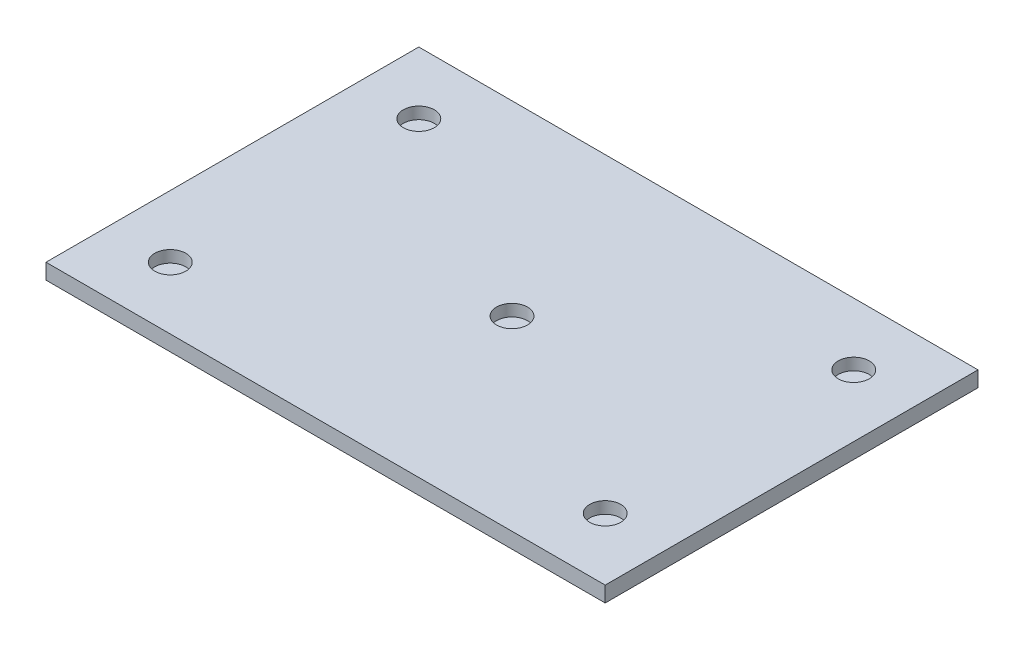
ISO-10303-21;
HEADER;
FILE_DESCRIPTION(('STEP AP214'),'2;1');
FILE_NAME('part.step','',(''),(''),'','','');
FILE_SCHEMA(('AUTOMOTIVE_DESIGN { 1 0 10303 214 1 1 1 1 }'));
ENDSEC;
DATA;
#1=APPLICATION_CONTEXT('core data for automotive mechanical design processes');
#2=APPLICATION_PROTOCOL_DEFINITION('international standard','automotive_design',2000,#1);
#3=PRODUCT_CONTEXT('',#1,'mechanical');
#4=PRODUCT('Part','Part','',(#3));
#5=PRODUCT_RELATED_PRODUCT_CATEGORY('part','',(#4));
#6=PRODUCT_DEFINITION_FORMATION('','',#4);
#7=PRODUCT_DEFINITION_CONTEXT('part definition',#1,'design');
#8=PRODUCT_DEFINITION('design','',#6,#7);
#9=PRODUCT_DEFINITION_SHAPE('','',#8);
#10=(LENGTH_UNIT() NAMED_UNIT(*) SI_UNIT(.MILLI.,.METRE.));
#11=(NAMED_UNIT(*) PLANE_ANGLE_UNIT() SI_UNIT($,.RADIAN.));
#12=(NAMED_UNIT(*) SI_UNIT($,.STERADIAN.) SOLID_ANGLE_UNIT());
#13=UNCERTAINTY_MEASURE_WITH_UNIT(LENGTH_MEASURE(1.E-05),#10,'distance_accuracy_value','');
#14=(GEOMETRIC_REPRESENTATION_CONTEXT(3) GLOBAL_UNCERTAINTY_ASSIGNED_CONTEXT((#13)) GLOBAL_UNIT_ASSIGNED_CONTEXT((#10,
#11,#12)) REPRESENTATION_CONTEXT('',''));
#15=CARTESIAN_POINT('',(0.,0.,0.));
#16=DIRECTION('',(0.,0.,1.));
#17=DIRECTION('',(1.,0.,0.));
#18=AXIS2_PLACEMENT_3D('',#15,#16,#17);
#19=CARTESIAN_POINT('',(114.3,6.35,-76.2));
#20=DIRECTION('',(-1.,0.,0.));
#21=DIRECTION('',(0.,0.,1.));
#22=AXIS2_PLACEMENT_3D('',#19,#20,#21);
#23=PLANE('',#22);
#24=DIRECTION('',(0.,0.,-1.));
#25=VECTOR('',#24,1.);
#26=CARTESIAN_POINT('',(114.3,0.,-76.2));
#27=LINE('',#26,#25);
#28=CARTESIAN_POINT('',(114.3,0.,76.2));
#29=VERTEX_POINT('',#28);
#30=CARTESIAN_POINT('',(114.3,0.,-76.2));
#31=VERTEX_POINT('',#30);
#32=EDGE_CURVE('E113',#29,#31,#27,.T.);
#33=ORIENTED_EDGE('',*,*,#32,.T.);
#34=DIRECTION('',(0.,-1.,0.));
#35=VECTOR('',#34,1.);
#36=CARTESIAN_POINT('',(114.3,6.35,-76.2));
#37=LINE('',#36,#35);
#38=CARTESIAN_POINT('',(114.3,6.35,-76.2));
#39=VERTEX_POINT('',#38);
#40=EDGE_CURVE('E11',#39,#31,#37,.T.);
#41=ORIENTED_EDGE('',*,*,#40,.F.);
#42=DIRECTION('',(0.,0.,-1.));
#43=VECTOR('',#42,1.);
#44=CARTESIAN_POINT('',(114.3,6.35,-76.2));
#45=LINE('',#44,#43);
#46=CARTESIAN_POINT('',(114.3,6.35,76.2));
#47=VERTEX_POINT('',#46);
#48=EDGE_CURVE('E97',#47,#39,#45,.T.);
#49=ORIENTED_EDGE('',*,*,#48,.F.);
#50=DIRECTION('',(0.,-1.,0.));
#51=VECTOR('',#50,1.);
#52=CARTESIAN_POINT('',(114.3,6.35,76.2));
#53=LINE('',#52,#51);
#54=EDGE_CURVE('E109',#47,#29,#53,.T.);
#55=ORIENTED_EDGE('',*,*,#54,.T.);
#56=EDGE_LOOP('',(#33,#41,#49,#55));
#57=FACE_BOUND('',#56,.T.);
#58=ADVANCED_FACE('F45',(#57),#23,.F.);
#59=CARTESIAN_POINT('',(-114.3,6.35,-76.2));
#60=DIRECTION('',(0.,0.,1.));
#61=DIRECTION('',(1.,0.,0.));
#62=AXIS2_PLACEMENT_3D('',#59,#60,#61);
#63=PLANE('',#62);
#64=DIRECTION('',(-1.,0.,0.));
#65=VECTOR('',#64,1.);
#66=CARTESIAN_POINT('',(-114.3,0.,-76.2));
#67=LINE('',#66,#65);
#68=CARTESIAN_POINT('',(-114.3,0.,-76.2));
#69=VERTEX_POINT('',#68);
#70=EDGE_CURVE('E102',#31,#69,#67,.T.);
#71=ORIENTED_EDGE('',*,*,#70,.T.);
#72=DIRECTION('',(0.,-1.,0.));
#73=VECTOR('',#72,1.);
#74=CARTESIAN_POINT('',(-114.3,6.35,-76.2));
#75=LINE('',#74,#73);
#76=CARTESIAN_POINT('',(-114.3,6.35,-76.2));
#77=VERTEX_POINT('',#76);
#78=EDGE_CURVE('E54',#77,#69,#75,.T.);
#79=ORIENTED_EDGE('',*,*,#78,.F.);
#80=DIRECTION('',(-1.,0.,0.));
#81=VECTOR('',#80,1.);
#82=CARTESIAN_POINT('',(-114.3,6.35,-76.2));
#83=LINE('',#82,#81);
#84=EDGE_CURVE('E92',#39,#77,#83,.T.);
#85=ORIENTED_EDGE('',*,*,#84,.F.);
#86=ORIENTED_EDGE('',*,*,#40,.T.);
#87=EDGE_LOOP('',(#71,#79,#85,#86));
#88=FACE_BOUND('',#87,.T.);
#89=ADVANCED_FACE('F101',(#88),#63,.F.);
#90=CARTESIAN_POINT('',(-114.3,6.35,-76.2));
#91=DIRECTION('',(1.,0.,0.));
#92=DIRECTION('',(0.,0.,-1.));
#93=AXIS2_PLACEMENT_3D('',#90,#91,#92);
#94=PLANE('',#93);
#95=DIRECTION('',(0.,0.,1.));
#96=VECTOR('',#95,1.);
#97=CARTESIAN_POINT('',(-114.3,0.,-76.2));
#98=LINE('',#97,#96);
#99=CARTESIAN_POINT('',(-114.3,0.,76.2));
#100=VERTEX_POINT('',#99);
#101=EDGE_CURVE('E79',#69,#100,#98,.T.);
#102=ORIENTED_EDGE('',*,*,#101,.T.);
#103=DIRECTION('',(0.,-1.,0.));
#104=VECTOR('',#103,1.);
#105=CARTESIAN_POINT('',(-114.3,6.35,76.2));
#106=LINE('',#105,#104);
#107=CARTESIAN_POINT('',(-114.3,6.35,76.2));
#108=VERTEX_POINT('',#107);
#109=EDGE_CURVE('E104',#108,#100,#106,.T.);
#110=ORIENTED_EDGE('',*,*,#109,.F.);
#111=DIRECTION('',(0.,0.,1.));
#112=VECTOR('',#111,1.);
#113=CARTESIAN_POINT('',(-114.3,6.35,-76.2));
#114=LINE('',#113,#112);
#115=EDGE_CURVE('E95',#77,#108,#114,.T.);
#116=ORIENTED_EDGE('',*,*,#115,.F.);
#117=ORIENTED_EDGE('',*,*,#78,.T.);
#118=EDGE_LOOP('',(#102,#110,#116,#117));
#119=FACE_BOUND('',#118,.T.);
#120=ADVANCED_FACE('F105',(#119),#94,.F.);
#121=CARTESIAN_POINT('',(-114.3,6.35,76.2));
#122=DIRECTION('',(0.,0.,-1.));
#123=DIRECTION('',(-1.,0.,0.));
#124=AXIS2_PLACEMENT_3D('',#121,#122,#123);
#125=PLANE('',#124);
#126=DIRECTION('',(1.,0.,0.));
#127=VECTOR('',#126,1.);
#128=CARTESIAN_POINT('',(-114.3,0.,76.2));
#129=LINE('',#128,#127);
#130=EDGE_CURVE('E85',#100,#29,#129,.T.);
#131=ORIENTED_EDGE('',*,*,#130,.T.);
#132=ORIENTED_EDGE('',*,*,#54,.F.);
#133=DIRECTION('',(1.,0.,0.));
#134=VECTOR('',#133,1.);
#135=CARTESIAN_POINT('',(-114.3,6.35,76.2));
#136=LINE('',#135,#134);
#137=EDGE_CURVE('E62',#108,#47,#136,.T.);
#138=ORIENTED_EDGE('',*,*,#137,.F.);
#139=ORIENTED_EDGE('',*,*,#109,.T.);
#140=EDGE_LOOP('',(#131,#132,#138,#139));
#141=FACE_BOUND('',#140,.T.);
#142=ADVANCED_FACE('F127',(#141),#125,.F.);
#143=CARTESIAN_POINT('',(0.,6.35,0.));
#144=DIRECTION('',(0.,1.,0.));
#145=DIRECTION('',(0.,0.,1.));
#146=AXIS2_PLACEMENT_3D('',#143,#144,#145);
#147=PLANE('',#146);
#148=CARTESIAN_POINT('',(0.,6.35,0.));
#149=DIRECTION('',(0.,1.,0.));
#150=DIRECTION('',(0.,0.,1.));
#151=AXIS2_PLACEMENT_3D('',#148,#149,#150);
#152=CIRCLE('',#151,6.35);
#153=CARTESIAN_POINT('',(0.,6.35,6.35));
#154=VERTEX_POINT('',#153);
#155=EDGE_CURVE('E146',#154,#154,#152,.T.);
#156=ORIENTED_EDGE('',*,*,#155,.F.);
#157=EDGE_LOOP('',(#156));
#158=FACE_BOUND('',#157,.T.);
#159=CARTESIAN_POINT('',(88.9,6.35,-50.8));
#160=DIRECTION('',(0.,1.,0.));
#161=DIRECTION('',(0.,0.,-1.));
#162=AXIS2_PLACEMENT_3D('',#159,#160,#161);
#163=CIRCLE('',#162,6.35);
#164=CARTESIAN_POINT('',(88.9,6.35,-57.15));
#165=VERTEX_POINT('',#164);
#166=EDGE_CURVE('E154',#165,#165,#163,.T.);
#167=ORIENTED_EDGE('',*,*,#166,.F.);
#168=EDGE_LOOP('',(#167));
#169=FACE_BOUND('',#168,.T.);
#170=CARTESIAN_POINT('',(88.9,6.35,50.8));
#171=DIRECTION('',(0.,1.,0.));
#172=DIRECTION('',(0.,0.,1.));
#173=AXIS2_PLACEMENT_3D('',#170,#171,#172);
#174=CIRCLE('',#173,6.35);
#175=CARTESIAN_POINT('',(88.9,6.35,57.15));
#176=VERTEX_POINT('',#175);
#177=EDGE_CURVE('E162',#176,#176,#174,.T.);
#178=ORIENTED_EDGE('',*,*,#177,.F.);
#179=EDGE_LOOP('',(#178));
#180=FACE_BOUND('',#179,.T.);
#181=CARTESIAN_POINT('',(-88.9,6.35,50.8));
#182=DIRECTION('',(0.,1.,0.));
#183=DIRECTION('',(0.,0.,-1.));
#184=AXIS2_PLACEMENT_3D('',#181,#182,#183);
#185=CIRCLE('',#184,6.35);
#186=CARTESIAN_POINT('',(-88.9,6.35,44.45));
#187=VERTEX_POINT('',#186);
#188=EDGE_CURVE('E138',#187,#187,#185,.T.);
#189=ORIENTED_EDGE('',*,*,#188,.F.);
#190=EDGE_LOOP('',(#189));
#191=FACE_BOUND('',#190,.T.);
#192=CARTESIAN_POINT('',(-88.9,6.35,-50.8));
#193=DIRECTION('',(0.,1.,0.));
#194=DIRECTION('',(0.,0.,1.));
#195=AXIS2_PLACEMENT_3D('',#192,#193,#194);
#196=CIRCLE('',#195,6.35);
#197=CARTESIAN_POINT('',(-88.9,6.35,-44.45));
#198=VERTEX_POINT('',#197);
#199=EDGE_CURVE('E134',#198,#198,#196,.T.);
#200=ORIENTED_EDGE('',*,*,#199,.F.);
#201=EDGE_LOOP('',(#200));
#202=FACE_BOUND('',#201,.T.);
#203=ORIENTED_EDGE('',*,*,#48,.T.);
#204=ORIENTED_EDGE('',*,*,#84,.T.);
#205=ORIENTED_EDGE('',*,*,#115,.T.);
#206=ORIENTED_EDGE('',*,*,#137,.T.);
#207=EDGE_LOOP('',(#203,#204,#205,#206));
#208=FACE_BOUND('',#207,.T.);
#209=ADVANCED_FACE('F93',(#158,#169,#180,#191,#202,#208),#147,.T.);
#210=CARTESIAN_POINT('',(0.,0.,0.));
#211=DIRECTION('',(0.,1.,0.));
#212=DIRECTION('',(0.,0.,1.));
#213=AXIS2_PLACEMENT_3D('',#210,#211,#212);
#214=PLANE('',#213);
#215=ORIENTED_EDGE('',*,*,#32,.F.);
#216=ORIENTED_EDGE('',*,*,#130,.F.);
#217=ORIENTED_EDGE('',*,*,#101,.F.);
#218=ORIENTED_EDGE('',*,*,#70,.F.);
#219=EDGE_LOOP('',(#215,#216,#217,#218));
#220=FACE_BOUND('',#219,.T.);
#221=ADVANCED_FACE('F130',(#220),#214,.F.);
#222=CARTESIAN_POINT('',(-88.9,1.524,-50.8));
#223=DIRECTION('',(0.,1.,0.));
#224=DIRECTION('',(0.,0.,1.));
#225=AXIS2_PLACEMENT_3D('',#222,#223,#224);
#226=CYLINDRICAL_SURFACE('',#225,6.35);
#227=CARTESIAN_POINT('',(-88.9,1.524,-50.8));
#228=DIRECTION('',(0.,1.,0.));
#229=DIRECTION('',(0.,0.,1.));
#230=AXIS2_PLACEMENT_3D('',#227,#228,#229);
#231=CIRCLE('',#230,6.35);
#232=CARTESIAN_POINT('',(-88.9,1.524,-44.45));
#233=VERTEX_POINT('',#232);
#234=EDGE_CURVE('E117',#233,#233,#231,.T.);
#235=ORIENTED_EDGE('',*,*,#234,.F.);
#236=EDGE_LOOP('',(#235));
#237=FACE_BOUND('',#236,.T.);
#238=ORIENTED_EDGE('',*,*,#199,.T.);
#239=EDGE_LOOP('',(#238));
#240=FACE_BOUND('',#239,.T.);
#241=ADVANCED_FACE('F182',(#237,#240),#226,.F.);
#242=CARTESIAN_POINT('',(-88.9,1.524,-50.8));
#243=DIRECTION('',(0.,1.,0.));
#244=DIRECTION('',(0.,0.,1.));
#245=AXIS2_PLACEMENT_3D('',#242,#243,#244);
#246=PLANE('',#245);
#247=ORIENTED_EDGE('',*,*,#234,.T.);
#248=EDGE_LOOP('',(#247));
#249=FACE_BOUND('',#248,.T.);
#250=ADVANCED_FACE('F184',(#249),#246,.T.);
#251=CARTESIAN_POINT('',(-88.9,1.524,50.8));
#252=DIRECTION('',(0.,1.,0.));
#253=DIRECTION('',(0.,0.,1.));
#254=AXIS2_PLACEMENT_3D('',#251,#252,#253);
#255=CYLINDRICAL_SURFACE('',#254,6.35);
#256=CARTESIAN_POINT('',(-88.9,1.524,50.8));
#257=DIRECTION('',(0.,1.,0.));
#258=DIRECTION('',(0.,0.,-1.));
#259=AXIS2_PLACEMENT_3D('',#256,#257,#258);
#260=CIRCLE('',#259,6.35);
#261=CARTESIAN_POINT('',(-88.9,1.524,44.45));
#262=VERTEX_POINT('',#261);
#263=EDGE_CURVE('E166',#262,#262,#260,.T.);
#264=ORIENTED_EDGE('',*,*,#263,.F.);
#265=EDGE_LOOP('',(#264));
#266=FACE_BOUND('',#265,.T.);
#267=ORIENTED_EDGE('',*,*,#188,.T.);
#268=EDGE_LOOP('',(#267));
#269=FACE_BOUND('',#268,.T.);
#270=ADVANCED_FACE('F174',(#266,#269),#255,.F.);
#271=CARTESIAN_POINT('',(-88.9,1.524,50.8));
#272=DIRECTION('',(0.,-1.,0.));
#273=DIRECTION('',(0.,0.,-1.));
#274=AXIS2_PLACEMENT_3D('',#271,#272,#273);
#275=PLANE('',#274);
#276=ORIENTED_EDGE('',*,*,#263,.T.);
#277=EDGE_LOOP('',(#276));
#278=FACE_BOUND('',#277,.T.);
#279=ADVANCED_FACE('F240',(#278),#275,.F.);
#280=CARTESIAN_POINT('',(88.9,1.524,50.8));
#281=DIRECTION('',(0.,1.,0.));
#282=DIRECTION('',(0.,0.,1.));
#283=AXIS2_PLACEMENT_3D('',#280,#281,#282);
#284=CYLINDRICAL_SURFACE('',#283,6.35);
#285=CARTESIAN_POINT('',(88.9,1.524,50.8));
#286=DIRECTION('',(0.,1.,0.));
#287=DIRECTION('',(0.,0.,1.));
#288=AXIS2_PLACEMENT_3D('',#285,#286,#287);
#289=CIRCLE('',#288,6.35);
#290=CARTESIAN_POINT('',(88.9,1.524,57.15));
#291=VERTEX_POINT('',#290);
#292=EDGE_CURVE('E158',#291,#291,#289,.T.);
#293=ORIENTED_EDGE('',*,*,#292,.F.);
#294=EDGE_LOOP('',(#293));
#295=FACE_BOUND('',#294,.T.);
#296=ORIENTED_EDGE('',*,*,#177,.T.);
#297=EDGE_LOOP('',(#296));
#298=FACE_BOUND('',#297,.T.);
#299=ADVANCED_FACE('F249',(#295,#298),#284,.F.);
#300=CARTESIAN_POINT('',(88.9,1.524,50.8));
#301=DIRECTION('',(0.,1.,0.));
#302=DIRECTION('',(0.,0.,1.));
#303=AXIS2_PLACEMENT_3D('',#300,#301,#302);
#304=PLANE('',#303);
#305=ORIENTED_EDGE('',*,*,#292,.T.);
#306=EDGE_LOOP('',(#305));
#307=FACE_BOUND('',#306,.T.);
#308=ADVANCED_FACE('F258',(#307),#304,.T.);
#309=CARTESIAN_POINT('',(88.9,1.524,-50.8));
#310=DIRECTION('',(0.,1.,0.));
#311=DIRECTION('',(0.,0.,1.));
#312=AXIS2_PLACEMENT_3D('',#309,#310,#311);
#313=CYLINDRICAL_SURFACE('',#312,6.35);
#314=CARTESIAN_POINT('',(88.9,1.524,-50.8));
#315=DIRECTION('',(0.,1.,0.));
#316=DIRECTION('',(0.,0.,-1.));
#317=AXIS2_PLACEMENT_3D('',#314,#315,#316);
#318=CIRCLE('',#317,6.35);
#319=CARTESIAN_POINT('',(88.9,1.524,-57.15));
#320=VERTEX_POINT('',#319);
#321=EDGE_CURVE('E150',#320,#320,#318,.T.);
#322=ORIENTED_EDGE('',*,*,#321,.F.);
#323=EDGE_LOOP('',(#322));
#324=FACE_BOUND('',#323,.T.);
#325=ORIENTED_EDGE('',*,*,#166,.T.);
#326=EDGE_LOOP('',(#325));
#327=FACE_BOUND('',#326,.T.);
#328=ADVANCED_FACE('F267',(#324,#327),#313,.F.);
#329=CARTESIAN_POINT('',(88.9,1.524,-50.8));
#330=DIRECTION('',(0.,-1.,0.));
#331=DIRECTION('',(0.,0.,-1.));
#332=AXIS2_PLACEMENT_3D('',#329,#330,#331);
#333=PLANE('',#332);
#334=ORIENTED_EDGE('',*,*,#321,.T.);
#335=EDGE_LOOP('',(#334));
#336=FACE_BOUND('',#335,.T.);
#337=ADVANCED_FACE('F276',(#336),#333,.F.);
#338=CARTESIAN_POINT('',(0.,1.524,0.));
#339=DIRECTION('',(0.,1.,0.));
#340=DIRECTION('',(0.,0.,1.));
#341=AXIS2_PLACEMENT_3D('',#338,#339,#340);
#342=CYLINDRICAL_SURFACE('',#341,6.35);
#343=CARTESIAN_POINT('',(0.,1.524,0.));
#344=DIRECTION('',(0.,1.,0.));
#345=DIRECTION('',(0.,0.,1.));
#346=AXIS2_PLACEMENT_3D('',#343,#344,#345);
#347=CIRCLE('',#346,6.35);
#348=CARTESIAN_POINT('',(0.,1.524,6.35));
#349=VERTEX_POINT('',#348);
#350=EDGE_CURVE('E142',#349,#349,#347,.T.);
#351=ORIENTED_EDGE('',*,*,#350,.F.);
#352=EDGE_LOOP('',(#351));
#353=FACE_BOUND('',#352,.T.);
#354=ORIENTED_EDGE('',*,*,#155,.T.);
#355=EDGE_LOOP('',(#354));
#356=FACE_BOUND('',#355,.T.);
#357=ADVANCED_FACE('F285',(#353,#356),#342,.F.);
#358=CARTESIAN_POINT('',(0.,1.524,0.));
#359=DIRECTION('',(0.,1.,0.));
#360=DIRECTION('',(0.,0.,1.));
#361=AXIS2_PLACEMENT_3D('',#358,#359,#360);
#362=PLANE('',#361);
#363=ORIENTED_EDGE('',*,*,#350,.T.);
#364=EDGE_LOOP('',(#363));
#365=FACE_BOUND('',#364,.T.);
#366=ADVANCED_FACE('F294',(#365),#362,.T.);
#367=CLOSED_SHELL('',(#58,#89,#120,#142,#209,#221,#241,#250,#270,#279,#299,#308,#328,#337,#357,#366));
#368=MANIFOLD_SOLID_BREP('B2',#367);
#369=ADVANCED_BREP_SHAPE_REPRESENTATION('',(#18,#368),#14);
#370=SHAPE_DEFINITION_REPRESENTATION(#9,#369);
ENDSEC;
END-ISO-10303-21;
